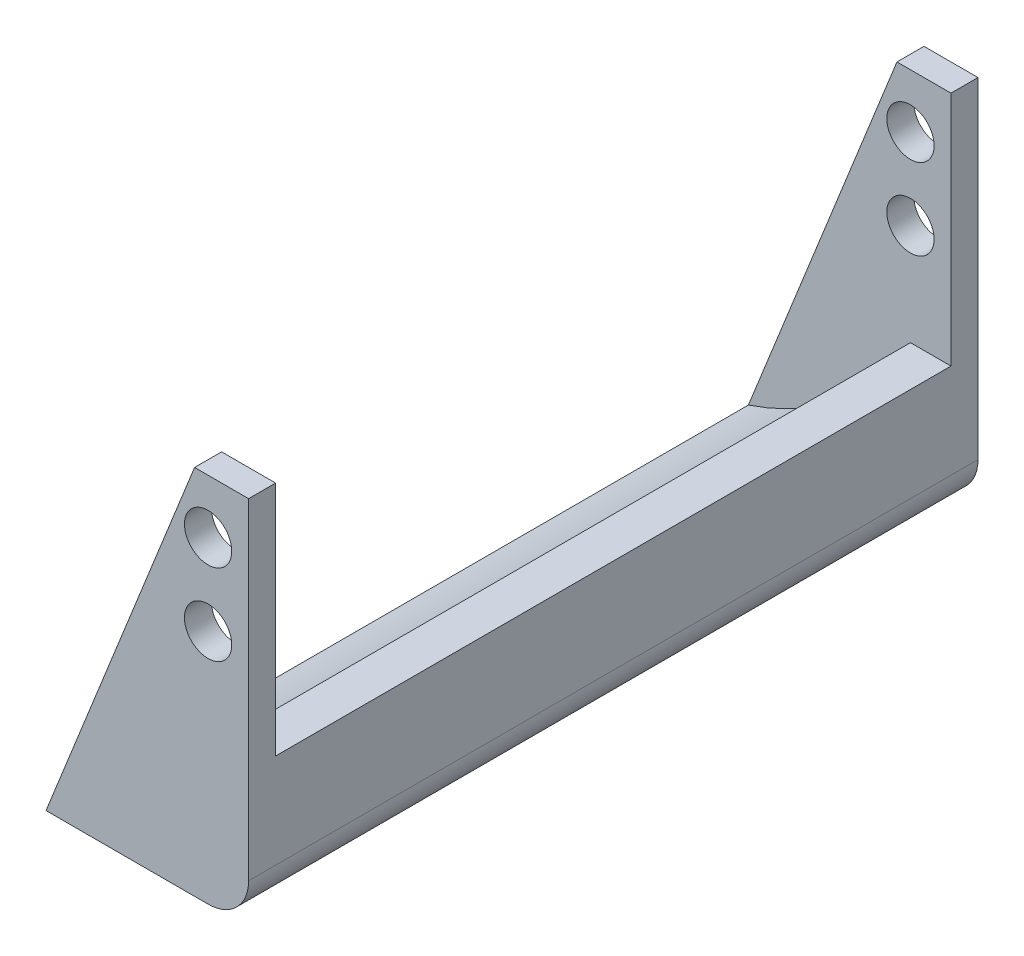
ISO-10303-21;
HEADER;
FILE_DESCRIPTION(('STEP AP214'),'2;1');
FILE_NAME('part.step','',(''),(''),'','','');
FILE_SCHEMA(('AUTOMOTIVE_DESIGN { 1 0 10303 214 1 1 1 1 }'));
ENDSEC;
DATA;
#1=APPLICATION_CONTEXT('core data for automotive mechanical design processes');
#2=APPLICATION_PROTOCOL_DEFINITION('international standard','automotive_design',2000,#1);
#3=PRODUCT_CONTEXT('',#1,'mechanical');
#4=PRODUCT('Part','Part','',(#3));
#5=PRODUCT_RELATED_PRODUCT_CATEGORY('part','',(#4));
#6=PRODUCT_DEFINITION_FORMATION('','',#4);
#7=PRODUCT_DEFINITION_CONTEXT('part definition',#1,'design');
#8=PRODUCT_DEFINITION('design','',#6,#7);
#9=PRODUCT_DEFINITION_SHAPE('','',#8);
#10=(LENGTH_UNIT() NAMED_UNIT(*) SI_UNIT(.MILLI.,.METRE.));
#11=(NAMED_UNIT(*) PLANE_ANGLE_UNIT() SI_UNIT($,.RADIAN.));
#12=(NAMED_UNIT(*) SI_UNIT($,.STERADIAN.) SOLID_ANGLE_UNIT());
#13=UNCERTAINTY_MEASURE_WITH_UNIT(LENGTH_MEASURE(1.E-05),#10,'distance_accuracy_value','');
#14=(GEOMETRIC_REPRESENTATION_CONTEXT(3) GLOBAL_UNCERTAINTY_ASSIGNED_CONTEXT((#13)) GLOBAL_UNIT_ASSIGNED_CONTEXT((#10,
#11,#12)) REPRESENTATION_CONTEXT('',''));
#15=CARTESIAN_POINT('',(0.,0.,0.));
#16=DIRECTION('',(0.,0.,1.));
#17=DIRECTION('',(1.,0.,0.));
#18=AXIS2_PLACEMENT_3D('',#15,#16,#17);
#19=CARTESIAN_POINT('',(-6.82367815065067,20.3884137807808,25.));
#20=DIRECTION('',(0.,0.,-1.));
#21=DIRECTION('',(-1.,0.,0.));
#22=AXIS2_PLACEMENT_3D('',#19,#20,#21);
#23=CYLINDRICAL_SURFACE('',#22,21.5);
#24=CARTESIAN_POINT('',(-6.82367815065067,20.3884137807808,-25.));
#25=DIRECTION('',(0.,0.,-1.));
#26=DIRECTION('',(1.,0.,0.));
#27=AXIS2_PLACEMENT_3D('',#24,#25,#26);
#28=CIRCLE('',#27,21.5);
#29=CARTESIAN_POINT('',(12.,10.,-25.));
#30=VERTEX_POINT('',#29);
#31=CARTESIAN_POINT('',(0.,0.,-25.));
#32=VERTEX_POINT('',#31);
#33=EDGE_CURVE('E185',#30,#32,#28,.T.);
#34=ORIENTED_EDGE('',*,*,#33,.T.);
#35=DIRECTION('',(0.,0.,-1.));
#36=VECTOR('',#35,1.);
#37=CARTESIAN_POINT('',(0.,0.,25.));
#38=LINE('',#37,#36);
#39=CARTESIAN_POINT('',(0.,0.,25.));
#40=VERTEX_POINT('',#39);
#41=EDGE_CURVE('E116',#40,#32,#38,.T.);
#42=ORIENTED_EDGE('',*,*,#41,.F.);
#43=CARTESIAN_POINT('',(-6.82367815065067,20.3884137807808,25.));
#44=DIRECTION('',(0.,0.,-1.));
#45=DIRECTION('',(1.,0.,0.));
#46=AXIS2_PLACEMENT_3D('',#43,#44,#45);
#47=CIRCLE('',#46,21.5);
#48=CARTESIAN_POINT('',(12.,10.,25.));
#49=VERTEX_POINT('',#48);
#50=EDGE_CURVE('E186',#49,#40,#47,.T.);
#51=ORIENTED_EDGE('',*,*,#50,.F.);
#52=DIRECTION('',(0.,0.,-1.));
#53=VECTOR('',#52,1.);
#54=CARTESIAN_POINT('',(12.,10.,25.));
#55=LINE('',#54,#53);
#56=EDGE_CURVE('E193',#49,#30,#55,.T.);
#57=ORIENTED_EDGE('',*,*,#56,.T.);
#58=EDGE_LOOP('',(#34,#42,#51,#57));
#59=FACE_BOUND('',#58,.T.);
#60=ADVANCED_FACE('F37',(#59),#23,.F.);
#61=CARTESIAN_POINT('',(0.,0.,25.));
#62=DIRECTION('',(0.,1.,0.));
#63=DIRECTION('',(0.,0.,1.));
#64=AXIS2_PLACEMENT_3D('',#61,#62,#63);
#65=PLANE('',#64);
#66=DIRECTION('',(1.,0.,0.));
#67=VECTOR('',#66,1.);
#68=CARTESIAN_POINT('',(0.,0.,-27.));
#69=LINE('',#68,#67);
#70=CARTESIAN_POINT('',(0.,0.,-27.));
#71=VERTEX_POINT('',#70);
#72=CARTESIAN_POINT('',(12.,0.,-27.));
#73=VERTEX_POINT('',#72);
#74=EDGE_CURVE('E114',#71,#73,#69,.T.);
#75=ORIENTED_EDGE('',*,*,#74,.T.);
#76=DIRECTION('',(0.,0.,-1.));
#77=VECTOR('',#76,1.);
#78=CARTESIAN_POINT('',(12.,0.,25.));
#79=LINE('',#78,#77);
#80=CARTESIAN_POINT('',(12.,0.,27.));
#81=VERTEX_POINT('',#80);
#82=EDGE_CURVE('E45',#73,#81,#79,.F.);
#83=ORIENTED_EDGE('',*,*,#82,.T.);
#84=DIRECTION('',(1.,0.,0.));
#85=VECTOR('',#84,1.);
#86=CARTESIAN_POINT('',(0.,0.,27.));
#87=LINE('',#86,#85);
#88=CARTESIAN_POINT('',(0.,0.,27.));
#89=VERTEX_POINT('',#88);
#90=EDGE_CURVE('E163',#89,#81,#87,.T.);
#91=ORIENTED_EDGE('',*,*,#90,.F.);
#92=DIRECTION('',(0.,0.,-1.));
#93=VECTOR('',#92,1.);
#94=CARTESIAN_POINT('',(0.,0.,27.));
#95=LINE('',#94,#93);
#96=EDGE_CURVE('E172',#89,#40,#95,.T.);
#97=ORIENTED_EDGE('',*,*,#96,.T.);
#98=ORIENTED_EDGE('',*,*,#41,.T.);
#99=DIRECTION('',(0.,0.,1.));
#100=VECTOR('',#99,1.);
#101=CARTESIAN_POINT('',(0.,0.,-27.));
#102=LINE('',#101,#100);
#103=EDGE_CURVE('E112',#71,#32,#102,.T.);
#104=ORIENTED_EDGE('',*,*,#103,.F.);
#105=EDGE_LOOP('',(#75,#83,#91,#97,#98,#104));
#106=FACE_BOUND('',#105,.T.);
#107=ADVANCED_FACE('F113',(#106),#65,.F.);
#108=CARTESIAN_POINT('',(15.,0.,25.));
#109=DIRECTION('',(-1.,0.,0.));
#110=DIRECTION('',(0.,0.,1.));
#111=AXIS2_PLACEMENT_3D('',#108,#109,#110);
#112=PLANE('',#111);
#113=DIRECTION('',(0.,1.,0.));
#114=VECTOR('',#113,1.);
#115=CARTESIAN_POINT('',(15.,0.,27.));
#116=LINE('',#115,#114);
#117=CARTESIAN_POINT('',(15.,3.,27.));
#118=VERTEX_POINT('',#117);
#119=CARTESIAN_POINT('',(15.,27.5,27.));
#120=VERTEX_POINT('',#119);
#121=EDGE_CURVE('E165',#118,#120,#116,.T.);
#122=ORIENTED_EDGE('',*,*,#121,.F.);
#123=DIRECTION('',(0.,0.,-1.));
#124=VECTOR('',#123,1.);
#125=CARTESIAN_POINT('',(15.,3.,25.));
#126=LINE('',#125,#124);
#127=CARTESIAN_POINT('',(15.,3.,-27.));
#128=VERTEX_POINT('',#127);
#129=EDGE_CURVE('E203',#118,#128,#126,.T.);
#130=ORIENTED_EDGE('',*,*,#129,.T.);
#131=DIRECTION('',(0.,1.,0.));
#132=VECTOR('',#131,1.);
#133=CARTESIAN_POINT('',(15.,0.,-27.));
#134=LINE('',#133,#132);
#135=CARTESIAN_POINT('',(15.,27.5,-27.));
#136=VERTEX_POINT('',#135);
#137=EDGE_CURVE('E135',#128,#136,#134,.T.);
#138=ORIENTED_EDGE('',*,*,#137,.T.);
#139=DIRECTION('',(0.,0.,1.));
#140=VECTOR('',#139,1.);
#141=CARTESIAN_POINT('',(15.,27.5,-27.));
#142=LINE('',#141,#140);
#143=CARTESIAN_POINT('',(15.,27.5,-25.));
#144=VERTEX_POINT('',#143);
#145=EDGE_CURVE('E140',#136,#144,#142,.T.);
#146=ORIENTED_EDGE('',*,*,#145,.T.);
#147=DIRECTION('',(0.,1.,0.));
#148=VECTOR('',#147,1.);
#149=CARTESIAN_POINT('',(15.,0.,-25.));
#150=LINE('',#149,#148);
#151=CARTESIAN_POINT('',(15.,10.,-25.));
#152=VERTEX_POINT('',#151);
#153=EDGE_CURVE('E130',#152,#144,#150,.T.);
#154=ORIENTED_EDGE('',*,*,#153,.F.);
#155=DIRECTION('',(0.,0.,-1.));
#156=VECTOR('',#155,1.);
#157=CARTESIAN_POINT('',(15.,10.,25.));
#158=LINE('',#157,#156);
#159=CARTESIAN_POINT('',(15.,10.,25.));
#160=VERTEX_POINT('',#159);
#161=EDGE_CURVE('E199',#160,#152,#158,.T.);
#162=ORIENTED_EDGE('',*,*,#161,.F.);
#163=DIRECTION('',(0.,1.,0.));
#164=VECTOR('',#163,1.);
#165=CARTESIAN_POINT('',(15.,0.,25.));
#166=LINE('',#165,#164);
#167=CARTESIAN_POINT('',(15.,27.5,25.));
#168=VERTEX_POINT('',#167);
#169=EDGE_CURVE('E160',#160,#168,#166,.T.);
#170=ORIENTED_EDGE('',*,*,#169,.T.);
#171=DIRECTION('',(0.,0.,-1.));
#172=VECTOR('',#171,1.);
#173=CARTESIAN_POINT('',(15.,27.5,27.));
#174=LINE('',#173,#172);
#175=EDGE_CURVE('E182',#120,#168,#174,.T.);
#176=ORIENTED_EDGE('',*,*,#175,.F.);
#177=EDGE_LOOP('',(#122,#130,#138,#146,#154,#162,#170,#176));
#178=FACE_BOUND('',#177,.T.);
#179=ADVANCED_FACE('F209',(#178),#112,.F.);
#180=CARTESIAN_POINT('',(12.,10.,25.));
#181=DIRECTION('',(0.,-1.,0.));
#182=DIRECTION('',(0.,0.,-1.));
#183=AXIS2_PLACEMENT_3D('',#180,#181,#182);
#184=PLANE('',#183);
#185=DIRECTION('',(-1.,0.,0.));
#186=VECTOR('',#185,1.);
#187=CARTESIAN_POINT('',(12.,10.,-25.));
#188=LINE('',#187,#186);
#189=EDGE_CURVE('E190',#152,#30,#188,.T.);
#190=ORIENTED_EDGE('',*,*,#189,.T.);
#191=ORIENTED_EDGE('',*,*,#56,.F.);
#192=DIRECTION('',(-1.,0.,0.));
#193=VECTOR('',#192,1.);
#194=CARTESIAN_POINT('',(12.,10.,25.));
#195=LINE('',#194,#193);
#196=EDGE_CURVE('E189',#160,#49,#195,.T.);
#197=ORIENTED_EDGE('',*,*,#196,.F.);
#198=ORIENTED_EDGE('',*,*,#161,.T.);
#199=EDGE_LOOP('',(#190,#191,#197,#198));
#200=FACE_BOUND('',#199,.T.);
#201=ADVANCED_FACE('F221',(#200),#184,.F.);
#202=CARTESIAN_POINT('',(0.,0.,25.));
#203=DIRECTION('',(0.,0.,1.));
#204=DIRECTION('',(1.,0.,0.));
#205=AXIS2_PLACEMENT_3D('',#202,#203,#204);
#206=PLANE('',#205);
#207=CARTESIAN_POINT('',(12.,23.5,25.));
#208=DIRECTION('',(0.,0.,1.));
#209=DIRECTION('',(1.,0.,0.));
#210=AXIS2_PLACEMENT_3D('',#207,#208,#209);
#211=CIRCLE('',#210,1.75);
#212=CARTESIAN_POINT('',(13.75,23.5,25.));
#213=VERTEX_POINT('',#212);
#214=EDGE_CURVE('E154',#213,#213,#211,.T.);
#215=ORIENTED_EDGE('',*,*,#214,.T.);
#216=EDGE_LOOP('',(#215));
#217=FACE_BOUND('',#216,.T.);
#218=CARTESIAN_POINT('',(12.,17.5,25.));
#219=DIRECTION('',(0.,0.,1.));
#220=DIRECTION('',(1.,0.,0.));
#221=AXIS2_PLACEMENT_3D('',#218,#219,#220);
#222=CIRCLE('',#221,1.75);
#223=CARTESIAN_POINT('',(13.75,17.5,25.));
#224=VERTEX_POINT('',#223);
#225=EDGE_CURVE('E122',#224,#224,#222,.T.);
#226=ORIENTED_EDGE('',*,*,#225,.T.);
#227=EDGE_LOOP('',(#226));
#228=FACE_BOUND('',#227,.T.);
#229=ORIENTED_EDGE('',*,*,#196,.T.);
#230=ORIENTED_EDGE('',*,*,#50,.T.);
#231=DIRECTION('',(-0.371390676354104,-0.928476690885259,0.));
#232=VECTOR('',#231,1.);
#233=CARTESIAN_POINT('',(11.,27.5,25.));
#234=LINE('',#233,#232);
#235=CARTESIAN_POINT('',(11.,27.5,25.));
#236=VERTEX_POINT('',#235);
#237=EDGE_CURVE('E166',#236,#40,#234,.T.);
#238=ORIENTED_EDGE('',*,*,#237,.F.);
#239=DIRECTION('',(-1.,0.,0.));
#240=VECTOR('',#239,1.);
#241=CARTESIAN_POINT('',(15.,27.5,25.));
#242=LINE('',#241,#240);
#243=EDGE_CURVE('E174',#168,#236,#242,.T.);
#244=ORIENTED_EDGE('',*,*,#243,.F.);
#245=ORIENTED_EDGE('',*,*,#169,.F.);
#246=EDGE_LOOP('',(#229,#230,#238,#244,#245));
#247=FACE_BOUND('',#246,.T.);
#248=ADVANCED_FACE('F226',(#217,#228,#247),#206,.F.);
#249=CARTESIAN_POINT('',(0.,0.,27.));
#250=DIRECTION('',(0.,0.,1.));
#251=DIRECTION('',(1.,0.,0.));
#252=AXIS2_PLACEMENT_3D('',#249,#250,#251);
#253=PLANE('',#252);
#254=CARTESIAN_POINT('',(12.,23.5,27.));
#255=DIRECTION('',(0.,0.,1.));
#256=DIRECTION('',(1.,0.,0.));
#257=AXIS2_PLACEMENT_3D('',#254,#255,#256);
#258=CIRCLE('',#257,1.75);
#259=CARTESIAN_POINT('',(13.75,23.5,27.));
#260=VERTEX_POINT('',#259);
#261=EDGE_CURVE('E157',#260,#260,#258,.T.);
#262=ORIENTED_EDGE('',*,*,#261,.F.);
#263=EDGE_LOOP('',(#262));
#264=FACE_BOUND('',#263,.T.);
#265=ORIENTED_EDGE('',*,*,#90,.T.);
#266=CARTESIAN_POINT('',(12.,3.,27.));
#267=DIRECTION('',(0.,0.,1.));
#268=DIRECTION('',(1.,0.,0.));
#269=AXIS2_PLACEMENT_3D('',#266,#267,#268);
#270=CIRCLE('',#269,3.);
#271=EDGE_CURVE('E11',#81,#118,#270,.T.);
#272=ORIENTED_EDGE('',*,*,#271,.T.);
#273=ORIENTED_EDGE('',*,*,#121,.T.);
#274=DIRECTION('',(-1.,0.,0.));
#275=VECTOR('',#274,1.);
#276=CARTESIAN_POINT('',(15.,27.5,27.));
#277=LINE('',#276,#275);
#278=CARTESIAN_POINT('',(11.,27.5,27.));
#279=VERTEX_POINT('',#278);
#280=EDGE_CURVE('E168',#120,#279,#277,.T.);
#281=ORIENTED_EDGE('',*,*,#280,.T.);
#282=DIRECTION('',(-0.371390676354104,-0.928476690885259,0.));
#283=VECTOR('',#282,1.);
#284=CARTESIAN_POINT('',(11.,27.5,27.));
#285=LINE('',#284,#283);
#286=EDGE_CURVE('E170',#279,#89,#285,.T.);
#287=ORIENTED_EDGE('',*,*,#286,.T.);
#288=EDGE_LOOP('',(#265,#272,#273,#281,#287));
#289=FACE_BOUND('',#288,.T.);
#290=CARTESIAN_POINT('',(12.,17.5,27.));
#291=DIRECTION('',(0.,0.,1.));
#292=DIRECTION('',(1.,0.,0.));
#293=AXIS2_PLACEMENT_3D('',#290,#291,#292);
#294=CIRCLE('',#293,1.75);
#295=CARTESIAN_POINT('',(13.75,17.5,27.));
#296=VERTEX_POINT('',#295);
#297=EDGE_CURVE('E151',#296,#296,#294,.T.);
#298=ORIENTED_EDGE('',*,*,#297,.F.);
#299=EDGE_LOOP('',(#298));
#300=FACE_BOUND('',#299,.T.);
#301=ADVANCED_FACE('F234',(#264,#289,#300),#253,.T.);
#302=CARTESIAN_POINT('',(15.,27.5,27.));
#303=DIRECTION('',(0.,-1.,0.));
#304=DIRECTION('',(1.,0.,0.));
#305=AXIS2_PLACEMENT_3D('',#302,#303,#304);
#306=PLANE('',#305);
#307=ORIENTED_EDGE('',*,*,#243,.T.);
#308=DIRECTION('',(0.,0.,-1.));
#309=VECTOR('',#308,1.);
#310=CARTESIAN_POINT('',(11.,27.5,27.));
#311=LINE('',#310,#309);
#312=EDGE_CURVE('E179',#279,#236,#311,.T.);
#313=ORIENTED_EDGE('',*,*,#312,.F.);
#314=ORIENTED_EDGE('',*,*,#280,.F.);
#315=ORIENTED_EDGE('',*,*,#175,.T.);
#316=EDGE_LOOP('',(#307,#313,#314,#315));
#317=FACE_BOUND('',#316,.T.);
#318=ADVANCED_FACE('F230',(#317),#306,.F.);
#319=CARTESIAN_POINT('',(11.,27.5,27.));
#320=DIRECTION('',(0.928476690885259,-0.371390676354104,0.));
#321=DIRECTION('',(0.371390676354104,0.928476690885259,0.));
#322=AXIS2_PLACEMENT_3D('',#319,#320,#321);
#323=PLANE('',#322);
#324=ORIENTED_EDGE('',*,*,#237,.T.);
#325=ORIENTED_EDGE('',*,*,#96,.F.);
#326=ORIENTED_EDGE('',*,*,#286,.F.);
#327=ORIENTED_EDGE('',*,*,#312,.T.);
#328=EDGE_LOOP('',(#324,#325,#326,#327));
#329=FACE_BOUND('',#328,.T.);
#330=ADVANCED_FACE('F258',(#329),#323,.F.);
#331=CARTESIAN_POINT('',(12.,23.5,27.));
#332=DIRECTION('',(0.,0.,-1.));
#333=DIRECTION('',(-1.,0.,0.));
#334=AXIS2_PLACEMENT_3D('',#331,#332,#333);
#335=CYLINDRICAL_SURFACE('',#334,1.75);
#336=ORIENTED_EDGE('',*,*,#261,.T.);
#337=EDGE_LOOP('',(#336));
#338=FACE_BOUND('',#337,.T.);
#339=ORIENTED_EDGE('',*,*,#214,.F.);
#340=EDGE_LOOP('',(#339));
#341=FACE_BOUND('',#340,.T.);
#342=ADVANCED_FACE('F261',(#338,#341),#335,.F.);
#343=CARTESIAN_POINT('',(12.,17.5,27.));
#344=DIRECTION('',(0.,0.,-1.));
#345=DIRECTION('',(-1.,0.,0.));
#346=AXIS2_PLACEMENT_3D('',#343,#344,#345);
#347=CYLINDRICAL_SURFACE('',#346,1.75);
#348=ORIENTED_EDGE('',*,*,#297,.T.);
#349=EDGE_LOOP('',(#348));
#350=FACE_BOUND('',#349,.T.);
#351=ORIENTED_EDGE('',*,*,#225,.F.);
#352=EDGE_LOOP('',(#351));
#353=FACE_BOUND('',#352,.T.);
#354=ADVANCED_FACE('F271',(#350,#353),#347,.F.);
#355=CARTESIAN_POINT('',(11.,27.5,-27.));
#356=DIRECTION('',(-0.928476690885259,0.371390676354104,0.));
#357=DIRECTION('',(-0.371390676354104,-0.928476690885259,0.));
#358=AXIS2_PLACEMENT_3D('',#355,#356,#357);
#359=PLANE('',#358);
#360=DIRECTION('',(-0.371390676354104,-0.928476690885259,0.));
#361=VECTOR('',#360,1.);
#362=CARTESIAN_POINT('',(11.,27.5,-25.));
#363=LINE('',#362,#361);
#364=CARTESIAN_POINT('',(11.,27.5,-25.));
#365=VERTEX_POINT('',#364);
#366=EDGE_CURVE('E141',#365,#32,#363,.T.);
#367=ORIENTED_EDGE('',*,*,#366,.F.);
#368=DIRECTION('',(0.,0.,1.));
#369=VECTOR('',#368,1.);
#370=CARTESIAN_POINT('',(11.,27.5,-27.));
#371=LINE('',#370,#369);
#372=CARTESIAN_POINT('',(11.,27.5,-27.));
#373=VERTEX_POINT('',#372);
#374=EDGE_CURVE('E123',#373,#365,#371,.T.);
#375=ORIENTED_EDGE('',*,*,#374,.F.);
#376=DIRECTION('',(-0.371390676354104,-0.928476690885259,0.));
#377=VECTOR('',#376,1.);
#378=CARTESIAN_POINT('',(11.,27.5,-27.));
#379=LINE('',#378,#377);
#380=EDGE_CURVE('E128',#373,#71,#379,.T.);
#381=ORIENTED_EDGE('',*,*,#380,.T.);
#382=ORIENTED_EDGE('',*,*,#103,.T.);
#383=EDGE_LOOP('',(#367,#375,#381,#382));
#384=FACE_BOUND('',#383,.T.);
#385=ADVANCED_FACE('F132',(#384),#359,.T.);
#386=CARTESIAN_POINT('',(15.,27.5,-27.));
#387=DIRECTION('',(0.,1.,0.));
#388=DIRECTION('',(-1.,0.,0.));
#389=AXIS2_PLACEMENT_3D('',#386,#387,#388);
#390=PLANE('',#389);
#391=DIRECTION('',(-1.,0.,0.));
#392=VECTOR('',#391,1.);
#393=CARTESIAN_POINT('',(15.,27.5,-25.));
#394=LINE('',#393,#392);
#395=EDGE_CURVE('E143',#144,#365,#394,.T.);
#396=ORIENTED_EDGE('',*,*,#395,.F.);
#397=ORIENTED_EDGE('',*,*,#145,.F.);
#398=DIRECTION('',(-1.,0.,0.));
#399=VECTOR('',#398,1.);
#400=CARTESIAN_POINT('',(15.,27.5,-27.));
#401=LINE('',#400,#399);
#402=EDGE_CURVE('E133',#136,#373,#401,.T.);
#403=ORIENTED_EDGE('',*,*,#402,.T.);
#404=ORIENTED_EDGE('',*,*,#374,.T.);
#405=EDGE_LOOP('',(#396,#397,#403,#404));
#406=FACE_BOUND('',#405,.T.);
#407=ADVANCED_FACE('F216',(#406),#390,.T.);
#408=CARTESIAN_POINT('',(0.,0.,-27.));
#409=DIRECTION('',(0.,0.,-1.));
#410=DIRECTION('',(1.,0.,0.));
#411=AXIS2_PLACEMENT_3D('',#408,#409,#410);
#412=PLANE('',#411);
#413=CARTESIAN_POINT('',(12.,17.5,-27.));
#414=DIRECTION('',(0.,0.,1.));
#415=DIRECTION('',(1.,0.,0.));
#416=AXIS2_PLACEMENT_3D('',#413,#414,#415);
#417=CIRCLE('',#416,1.75);
#418=CARTESIAN_POINT('',(13.75,17.5,-27.));
#419=VERTEX_POINT('',#418);
#420=EDGE_CURVE('E297',#419,#419,#417,.T.);
#421=ORIENTED_EDGE('',*,*,#420,.T.);
#422=EDGE_LOOP('',(#421));
#423=FACE_BOUND('',#422,.T.);
#424=CARTESIAN_POINT('',(12.,23.5,-27.));
#425=DIRECTION('',(0.,0.,1.));
#426=DIRECTION('',(1.,0.,0.));
#427=AXIS2_PLACEMENT_3D('',#424,#425,#426);
#428=CIRCLE('',#427,1.75);
#429=CARTESIAN_POINT('',(13.75,23.5,-27.));
#430=VERTEX_POINT('',#429);
#431=EDGE_CURVE('E144',#430,#430,#428,.T.);
#432=ORIENTED_EDGE('',*,*,#431,.T.);
#433=EDGE_LOOP('',(#432));
#434=FACE_BOUND('',#433,.T.);
#435=ORIENTED_EDGE('',*,*,#137,.F.);
#436=CARTESIAN_POINT('',(12.,3.,-27.));
#437=DIRECTION('',(0.,0.,-1.));
#438=DIRECTION('',(-1.,0.,0.));
#439=AXIS2_PLACEMENT_3D('',#436,#437,#438);
#440=CIRCLE('',#439,3.);
#441=EDGE_CURVE('E59',#128,#73,#440,.T.);
#442=ORIENTED_EDGE('',*,*,#441,.T.);
#443=ORIENTED_EDGE('',*,*,#74,.F.);
#444=ORIENTED_EDGE('',*,*,#380,.F.);
#445=ORIENTED_EDGE('',*,*,#402,.F.);
#446=EDGE_LOOP('',(#435,#442,#443,#444,#445));
#447=FACE_BOUND('',#446,.T.);
#448=ADVANCED_FACE('F126',(#423,#434,#447),#412,.T.);
#449=CARTESIAN_POINT('',(0.,0.,-25.));
#450=DIRECTION('',(0.,0.,-1.));
#451=DIRECTION('',(1.,0.,0.));
#452=AXIS2_PLACEMENT_3D('',#449,#450,#451);
#453=PLANE('',#452);
#454=ORIENTED_EDGE('',*,*,#33,.F.);
#455=ORIENTED_EDGE('',*,*,#189,.F.);
#456=ORIENTED_EDGE('',*,*,#153,.T.);
#457=ORIENTED_EDGE('',*,*,#395,.T.);
#458=ORIENTED_EDGE('',*,*,#366,.T.);
#459=EDGE_LOOP('',(#454,#455,#456,#457,#458));
#460=FACE_BOUND('',#459,.T.);
#461=CARTESIAN_POINT('',(12.,17.5,-25.));
#462=DIRECTION('',(0.,0.,1.));
#463=DIRECTION('',(1.,0.,0.));
#464=AXIS2_PLACEMENT_3D('',#461,#462,#463);
#465=CIRCLE('',#464,1.75);
#466=CARTESIAN_POINT('',(13.75,17.5,-25.));
#467=VERTEX_POINT('',#466);
#468=EDGE_CURVE('E300',#467,#467,#465,.T.);
#469=ORIENTED_EDGE('',*,*,#468,.F.);
#470=EDGE_LOOP('',(#469));
#471=FACE_BOUND('',#470,.T.);
#472=CARTESIAN_POINT('',(12.,23.5,-25.));
#473=DIRECTION('',(0.,0.,1.));
#474=DIRECTION('',(1.,0.,0.));
#475=AXIS2_PLACEMENT_3D('',#472,#473,#474);
#476=CIRCLE('',#475,1.75);
#477=CARTESIAN_POINT('',(13.75,23.5,-25.));
#478=VERTEX_POINT('',#477);
#479=EDGE_CURVE('E295',#478,#478,#476,.T.);
#480=ORIENTED_EDGE('',*,*,#479,.F.);
#481=EDGE_LOOP('',(#480));
#482=FACE_BOUND('',#481,.T.);
#483=ADVANCED_FACE('F280',(#460,#471,#482),#453,.F.);
#484=CARTESIAN_POINT('',(12.,23.5,-27.));
#485=DIRECTION('',(0.,0.,1.));
#486=DIRECTION('',(1.,0.,0.));
#487=AXIS2_PLACEMENT_3D('',#484,#485,#486);
#488=CYLINDRICAL_SURFACE('',#487,1.75);
#489=ORIENTED_EDGE('',*,*,#431,.F.);
#490=EDGE_LOOP('',(#489));
#491=FACE_BOUND('',#490,.T.);
#492=ORIENTED_EDGE('',*,*,#479,.T.);
#493=EDGE_LOOP('',(#492));
#494=FACE_BOUND('',#493,.T.);
#495=ADVANCED_FACE('F242',(#491,#494),#488,.F.);
#496=CARTESIAN_POINT('',(12.,17.5,-27.));
#497=DIRECTION('',(0.,0.,1.));
#498=DIRECTION('',(1.,0.,0.));
#499=AXIS2_PLACEMENT_3D('',#496,#497,#498);
#500=CYLINDRICAL_SURFACE('',#499,1.75);
#501=ORIENTED_EDGE('',*,*,#420,.F.);
#502=EDGE_LOOP('',(#501));
#503=FACE_BOUND('',#502,.T.);
#504=ORIENTED_EDGE('',*,*,#468,.T.);
#505=EDGE_LOOP('',(#504));
#506=FACE_BOUND('',#505,.T.);
#507=ADVANCED_FACE('F238',(#503,#506),#500,.F.);
#508=CARTESIAN_POINT('',(12.,3.,25.));
#509=DIRECTION('',(0.,0.,-1.));
#510=DIRECTION('',(-1.,0.,0.));
#511=AXIS2_PLACEMENT_3D('',#508,#509,#510);
#512=CYLINDRICAL_SURFACE('',#511,3.);
#513=ORIENTED_EDGE('',*,*,#271,.F.);
#514=ORIENTED_EDGE('',*,*,#82,.F.);
#515=ORIENTED_EDGE('',*,*,#441,.F.);
#516=ORIENTED_EDGE('',*,*,#129,.F.);
#517=EDGE_LOOP('',(#513,#514,#515,#516));
#518=FACE_BOUND('',#517,.T.);
#519=ADVANCED_FACE('F39',(#518),#512,.T.);
#520=CLOSED_SHELL('',(#60,#107,#179,#201,#248,#301,#318,#330,#342,#354,#385,#407,#448,#483,#495,
#507,#519));
#521=MANIFOLD_SOLID_BREP('B2',#520);
#522=ADVANCED_BREP_SHAPE_REPRESENTATION('',(#18,#521),#14);
#523=SHAPE_DEFINITION_REPRESENTATION(#9,#522);
ENDSEC;
END-ISO-10303-21;
